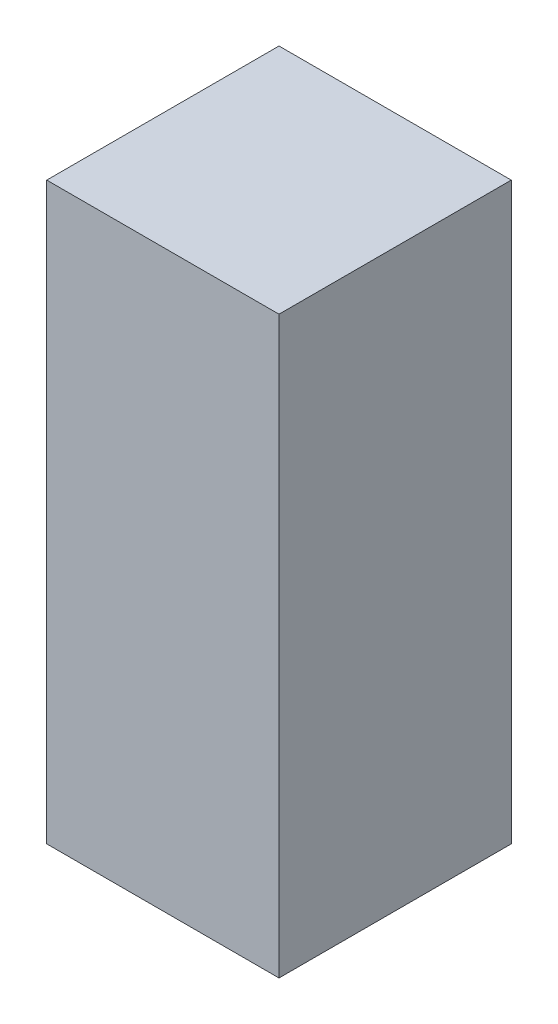
ISO-10303-21;
HEADER;
FILE_DESCRIPTION(('STEP AP214'),'2;1');
FILE_NAME('part.step','',(''),(''),'','','');
FILE_SCHEMA(('AUTOMOTIVE_DESIGN { 1 0 10303 214 1 1 1 1 }'));
ENDSEC;
DATA;
#1=APPLICATION_CONTEXT('core data for automotive mechanical design processes');
#2=APPLICATION_PROTOCOL_DEFINITION('international standard','automotive_design',2000,#1);
#3=PRODUCT_CONTEXT('',#1,'mechanical');
#4=PRODUCT('Part','Part','',(#3));
#5=PRODUCT_RELATED_PRODUCT_CATEGORY('part','',(#4));
#6=PRODUCT_DEFINITION_FORMATION('','',#4);
#7=PRODUCT_DEFINITION_CONTEXT('part definition',#1,'design');
#8=PRODUCT_DEFINITION('design','',#6,#7);
#9=PRODUCT_DEFINITION_SHAPE('','',#8);
#10=(LENGTH_UNIT() NAMED_UNIT(*) SI_UNIT(.MILLI.,.METRE.));
#11=(NAMED_UNIT(*) PLANE_ANGLE_UNIT() SI_UNIT($,.RADIAN.));
#12=(NAMED_UNIT(*) SI_UNIT($,.STERADIAN.) SOLID_ANGLE_UNIT());
#13=UNCERTAINTY_MEASURE_WITH_UNIT(LENGTH_MEASURE(1.E-05),#10,'distance_accuracy_value','');
#14=(GEOMETRIC_REPRESENTATION_CONTEXT(3) GLOBAL_UNCERTAINTY_ASSIGNED_CONTEXT((#13)) GLOBAL_UNIT_ASSIGNED_CONTEXT((#10,
#11,#12)) REPRESENTATION_CONTEXT('',''));
#15=CARTESIAN_POINT('',(0.,0.,0.));
#16=DIRECTION('',(0.,0.,1.));
#17=DIRECTION('',(1.,0.,0.));
#18=AXIS2_PLACEMENT_3D('',#15,#16,#17);
#19=CARTESIAN_POINT('',(5.1308,6.34999999999999,2.56539999999998));
#20=DIRECTION('',(0.,0.,-1.));
#21=DIRECTION('',(0.,1.,0.));
#22=AXIS2_PLACEMENT_3D('',#19,#20,#21);
#23=PLANE('',#22);
#24=DIRECTION('',(0.,-1.,0.));
#25=VECTOR('',#24,1.);
#26=CARTESIAN_POINT('',(0.,6.34999999999999,2.56539999999998));
#27=LINE('',#26,#25);
#28=CARTESIAN_POINT('',(0.,6.34999999999999,2.56539999999998));
#29=VERTEX_POINT('',#28);
#30=CARTESIAN_POINT('',(0.,-6.35000000000001,2.56539999999997));
#31=VERTEX_POINT('',#30);
#32=EDGE_CURVE('E96',#29,#31,#27,.T.);
#33=ORIENTED_EDGE('',*,*,#32,.T.);
#34=DIRECTION('',(-1.,0.,0.));
#35=VECTOR('',#34,1.);
#36=CARTESIAN_POINT('',(5.1308,-6.35000000000001,2.56539999999997));
#37=LINE('',#36,#35);
#38=CARTESIAN_POINT('',(5.1308,-6.35000000000001,2.56539999999997));
#39=VERTEX_POINT('',#38);
#40=EDGE_CURVE('E11',#39,#31,#37,.T.);
#41=ORIENTED_EDGE('',*,*,#40,.F.);
#42=DIRECTION('',(0.,-1.,0.));
#43=VECTOR('',#42,1.);
#44=CARTESIAN_POINT('',(5.1308,6.34999999999999,2.56539999999998));
#45=LINE('',#44,#43);
#46=CARTESIAN_POINT('',(5.1308,6.34999999999999,2.56539999999998));
#47=VERTEX_POINT('',#46);
#48=EDGE_CURVE('E84',#47,#39,#45,.T.);
#49=ORIENTED_EDGE('',*,*,#48,.F.);
#50=DIRECTION('',(-1.,0.,0.));
#51=VECTOR('',#50,1.);
#52=CARTESIAN_POINT('',(5.1308,6.34999999999999,2.56539999999998));
#53=LINE('',#52,#51);
#54=EDGE_CURVE('E92',#47,#29,#53,.T.);
#55=ORIENTED_EDGE('',*,*,#54,.T.);
#56=EDGE_LOOP('',(#33,#41,#49,#55));
#57=FACE_BOUND('',#56,.T.);
#58=ADVANCED_FACE('F33',(#57),#23,.F.);
#59=CARTESIAN_POINT('',(5.1308,-6.35000000000001,-2.56540000000002));
#60=DIRECTION('',(0.,1.,0.));
#61=DIRECTION('',(0.,0.,1.));
#62=AXIS2_PLACEMENT_3D('',#59,#60,#61);
#63=PLANE('',#62);
#64=DIRECTION('',(0.,0.,-1.));
#65=VECTOR('',#64,1.);
#66=CARTESIAN_POINT('',(0.,-6.35000000000001,-2.56540000000002));
#67=LINE('',#66,#65);
#68=CARTESIAN_POINT('',(0.,-6.35000000000001,-2.56540000000002));
#69=VERTEX_POINT('',#68);
#70=EDGE_CURVE('E88',#31,#69,#67,.T.);
#71=ORIENTED_EDGE('',*,*,#70,.T.);
#72=DIRECTION('',(-1.,0.,0.));
#73=VECTOR('',#72,1.);
#74=CARTESIAN_POINT('',(5.1308,-6.35000000000001,-2.56540000000002));
#75=LINE('',#74,#73);
#76=CARTESIAN_POINT('',(5.1308,-6.35000000000001,-2.56540000000002));
#77=VERTEX_POINT('',#76);
#78=EDGE_CURVE('E41',#77,#69,#75,.T.);
#79=ORIENTED_EDGE('',*,*,#78,.F.);
#80=DIRECTION('',(0.,0.,-1.));
#81=VECTOR('',#80,1.);
#82=CARTESIAN_POINT('',(5.1308,-6.35000000000001,-2.56540000000002));
#83=LINE('',#82,#81);
#84=EDGE_CURVE('E79',#39,#77,#83,.T.);
#85=ORIENTED_EDGE('',*,*,#84,.F.);
#86=ORIENTED_EDGE('',*,*,#40,.T.);
#87=EDGE_LOOP('',(#71,#79,#85,#86));
#88=FACE_BOUND('',#87,.T.);
#89=ADVANCED_FACE('F87',(#88),#63,.F.);
#90=CARTESIAN_POINT('',(5.1308,6.34999999999999,-2.56540000000001));
#91=DIRECTION('',(0.,0.,1.));
#92=DIRECTION('',(0.,-1.,0.));
#93=AXIS2_PLACEMENT_3D('',#90,#91,#92);
#94=PLANE('',#93);
#95=DIRECTION('',(0.,1.,0.));
#96=VECTOR('',#95,1.);
#97=CARTESIAN_POINT('',(0.,6.34999999999999,-2.56540000000001));
#98=LINE('',#97,#96);
#99=CARTESIAN_POINT('',(0.,6.34999999999999,-2.56540000000001));
#100=VERTEX_POINT('',#99);
#101=EDGE_CURVE('E66',#69,#100,#98,.T.);
#102=ORIENTED_EDGE('',*,*,#101,.T.);
#103=DIRECTION('',(-1.,0.,0.));
#104=VECTOR('',#103,1.);
#105=CARTESIAN_POINT('',(5.1308,6.34999999999999,-2.56540000000001));
#106=LINE('',#105,#104);
#107=CARTESIAN_POINT('',(5.1308,6.34999999999999,-2.56540000000001));
#108=VERTEX_POINT('',#107);
#109=EDGE_CURVE('E89',#108,#100,#106,.T.);
#110=ORIENTED_EDGE('',*,*,#109,.F.);
#111=DIRECTION('',(0.,1.,0.));
#112=VECTOR('',#111,1.);
#113=CARTESIAN_POINT('',(5.1308,6.34999999999999,-2.56540000000001));
#114=LINE('',#113,#112);
#115=EDGE_CURVE('E82',#77,#108,#114,.T.);
#116=ORIENTED_EDGE('',*,*,#115,.F.);
#117=ORIENTED_EDGE('',*,*,#78,.T.);
#118=EDGE_LOOP('',(#102,#110,#116,#117));
#119=FACE_BOUND('',#118,.T.);
#120=ADVANCED_FACE('F90',(#119),#94,.F.);
#121=CARTESIAN_POINT('',(5.1308,6.34999999999999,-2.56540000000001));
#122=DIRECTION('',(0.,-1.,0.));
#123=DIRECTION('',(0.,0.,-1.));
#124=AXIS2_PLACEMENT_3D('',#121,#122,#123);
#125=PLANE('',#124);
#126=DIRECTION('',(0.,0.,1.));
#127=VECTOR('',#126,1.);
#128=CARTESIAN_POINT('',(0.,6.34999999999999,-2.56540000000001));
#129=LINE('',#128,#127);
#130=EDGE_CURVE('E72',#100,#29,#129,.T.);
#131=ORIENTED_EDGE('',*,*,#130,.T.);
#132=ORIENTED_EDGE('',*,*,#54,.F.);
#133=DIRECTION('',(0.,0.,1.));
#134=VECTOR('',#133,1.);
#135=CARTESIAN_POINT('',(5.1308,6.34999999999999,-2.56540000000001));
#136=LINE('',#135,#134);
#137=EDGE_CURVE('E49',#108,#47,#136,.T.);
#138=ORIENTED_EDGE('',*,*,#137,.F.);
#139=ORIENTED_EDGE('',*,*,#109,.T.);
#140=EDGE_LOOP('',(#131,#132,#138,#139));
#141=FACE_BOUND('',#140,.T.);
#142=ADVANCED_FACE('F103',(#141),#125,.F.);
#143=CARTESIAN_POINT('',(5.1308,0.,0.));
#144=DIRECTION('',(-1.,0.,0.));
#145=DIRECTION('',(0.,0.,1.));
#146=AXIS2_PLACEMENT_3D('',#143,#144,#145);
#147=PLANE('',#146);
#148=ORIENTED_EDGE('',*,*,#48,.T.);
#149=ORIENTED_EDGE('',*,*,#84,.T.);
#150=ORIENTED_EDGE('',*,*,#115,.T.);
#151=ORIENTED_EDGE('',*,*,#137,.T.);
#152=EDGE_LOOP('',(#148,#149,#150,#151));
#153=FACE_BOUND('',#152,.T.);
#154=ADVANCED_FACE('F80',(#153),#147,.F.);
#155=CARTESIAN_POINT('',(0.,0.,0.));
#156=DIRECTION('',(-1.,0.,0.));
#157=DIRECTION('',(0.,0.,1.));
#158=AXIS2_PLACEMENT_3D('',#155,#156,#157);
#159=PLANE('',#158);
#160=ORIENTED_EDGE('',*,*,#32,.F.);
#161=ORIENTED_EDGE('',*,*,#130,.F.);
#162=ORIENTED_EDGE('',*,*,#101,.F.);
#163=ORIENTED_EDGE('',*,*,#70,.F.);
#164=EDGE_LOOP('',(#160,#161,#162,#163));
#165=FACE_BOUND('',#164,.T.);
#166=ADVANCED_FACE('F106',(#165),#159,.T.);
#167=CLOSED_SHELL('',(#58,#89,#120,#142,#154,#166));
#168=MANIFOLD_SOLID_BREP('B2',#167);
#169=ADVANCED_BREP_SHAPE_REPRESENTATION('',(#18,#168),#14);
#170=SHAPE_DEFINITION_REPRESENTATION(#9,#169);
ENDSEC;
END-ISO-10303-21;
